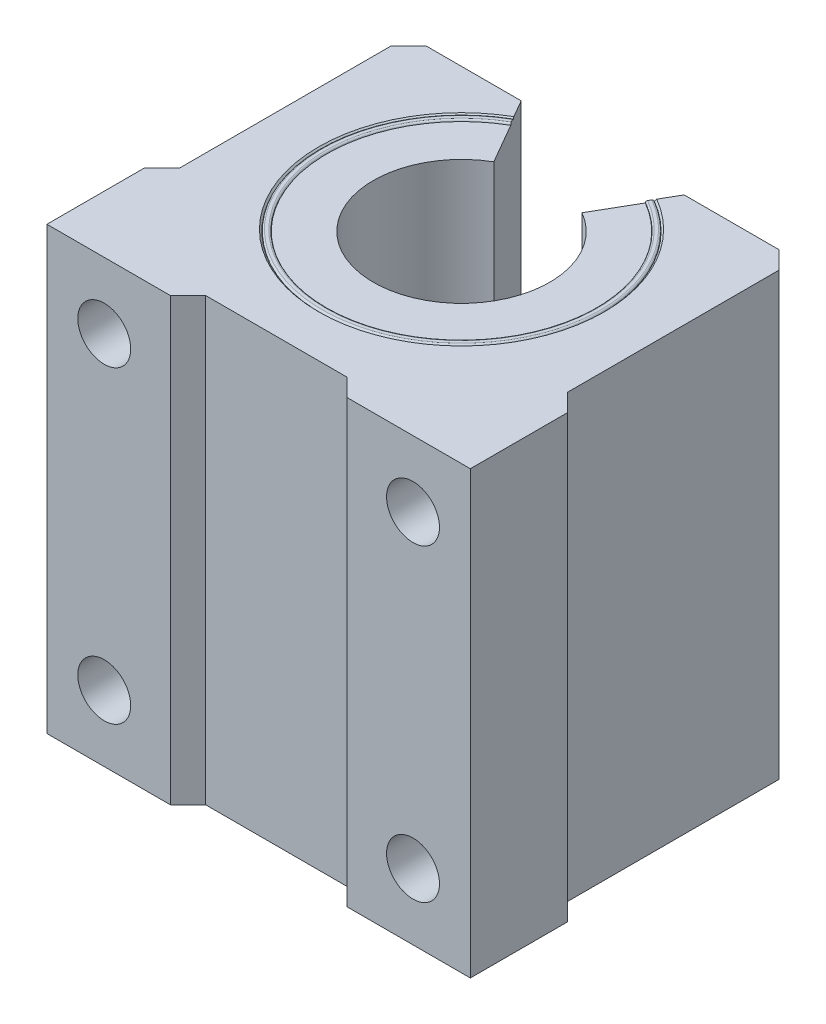
ISO-10303-21;
HEADER;
FILE_DESCRIPTION(('STEP AP214'),'2;1');
FILE_NAME('part.step','',(''),(''),'','','');
FILE_SCHEMA(('AUTOMOTIVE_DESIGN { 1 0 10303 214 1 1 1 1 }'));
ENDSEC;
DATA;
#1=APPLICATION_CONTEXT('core data for automotive mechanical design processes');
#2=APPLICATION_PROTOCOL_DEFINITION('international standard','automotive_design',2000,#1);
#3=PRODUCT_CONTEXT('',#1,'mechanical');
#4=PRODUCT('Part','Part','',(#3));
#5=PRODUCT_RELATED_PRODUCT_CATEGORY('part','',(#4));
#6=PRODUCT_DEFINITION_FORMATION('','',#4);
#7=PRODUCT_DEFINITION_CONTEXT('part definition',#1,'design');
#8=PRODUCT_DEFINITION('design','',#6,#7);
#9=PRODUCT_DEFINITION_SHAPE('','',#8);
#10=(LENGTH_UNIT() NAMED_UNIT(*) SI_UNIT(.MILLI.,.METRE.));
#11=(NAMED_UNIT(*) PLANE_ANGLE_UNIT() SI_UNIT($,.RADIAN.));
#12=(NAMED_UNIT(*) SI_UNIT($,.STERADIAN.) SOLID_ANGLE_UNIT());
#13=UNCERTAINTY_MEASURE_WITH_UNIT(LENGTH_MEASURE(1.E-05),#10,'distance_accuracy_value','');
#14=(GEOMETRIC_REPRESENTATION_CONTEXT(3) GLOBAL_UNCERTAINTY_ASSIGNED_CONTEXT((#13)) GLOBAL_UNIT_ASSIGNED_CONTEXT((#10,
#11,#12)) REPRESENTATION_CONTEXT('',''));
#15=CARTESIAN_POINT('',(0.,0.,0.));
#16=DIRECTION('',(0.,0.,1.));
#17=DIRECTION('',(1.,0.,0.));
#18=AXIS2_PLACEMENT_3D('',#15,#16,#17);
#19=CARTESIAN_POINT('',(0.,25.,0.));
#20=DIRECTION('',(0.,1.,0.));
#21=DIRECTION('',(0.,0.,1.));
#22=AXIS2_PLACEMENT_3D('',#19,#20,#21);
#23=PLANE('',#22);
#24=CARTESIAN_POINT('',(0.,25.,0.));
#25=DIRECTION('',(0.,1.,0.));
#26=DIRECTION('',(0.,0.,1.));
#27=AXIS2_PLACEMENT_3D('',#24,#25,#26);
#28=CIRCLE('',#27,15.45);
#29=CARTESIAN_POINT('',(-7.72500000000002,25.,-13.3800924884696));
#30=VERTEX_POINT('',#29);
#31=CARTESIAN_POINT('',(7.72499999999998,25.,-13.3800924884696));
#32=VERTEX_POINT('',#31);
#33=EDGE_CURVE('E221',#30,#32,#28,.T.);
#34=ORIENTED_EDGE('',*,*,#33,.F.);
#35=DIRECTION('',(-0.499999999999995,0.,-0.866025403784441));
#36=VECTOR('',#35,1.);
#37=CARTESIAN_POINT('',(-9.23760430703402,25.,-16.));
#38=LINE('',#37,#36);
#39=CARTESIAN_POINT('',(-7.89938053086695,25.,-13.6821284277819));
#40=VERTEX_POINT('',#39);
#41=EDGE_CURVE('E254',#30,#40,#38,.T.);
#42=ORIENTED_EDGE('',*,*,#41,.T.);
#43=CARTESIAN_POINT('',(0.,25.,0.));
#44=DIRECTION('',(0.,-1.,0.));
#45=DIRECTION('',(0.,0.,-1.));
#46=AXIS2_PLACEMENT_3D('',#43,#44,#45);
#47=CIRCLE('',#46,15.7987610617339);
#48=CARTESIAN_POINT('',(7.89938053086692,25.,-13.6821284277819));
#49=VERTEX_POINT('',#48);
#50=EDGE_CURVE('E244',#40,#49,#47,.F.);
#51=ORIENTED_EDGE('',*,*,#50,.T.);
#52=DIRECTION('',(-0.500000000000007,0.,0.866025403784435));
#53=VECTOR('',#52,1.);
#54=CARTESIAN_POINT('',(9.23760430703402,25.,-16.));
#55=LINE('',#54,#53);
#56=EDGE_CURVE('E237',#49,#32,#55,.T.);
#57=ORIENTED_EDGE('',*,*,#56,.T.);
#58=EDGE_LOOP('',(#34,#42,#51,#57));
#59=FACE_BOUND('',#58,.T.);
#60=ADVANCED_FACE('F36',(#59),#23,.T.);
#61=CARTESIAN_POINT('',(0.,-25.,0.));
#62=DIRECTION('',(0.,1.,0.));
#63=DIRECTION('',(0.,0.,1.));
#64=AXIS2_PLACEMENT_3D('',#61,#62,#63);
#65=PLANE('',#64);
#66=CARTESIAN_POINT('',(0.,-25.,0.));
#67=DIRECTION('',(0.,1.,0.));
#68=DIRECTION('',(0.,0.,1.));
#69=AXIS2_PLACEMENT_3D('',#66,#67,#68);
#70=CIRCLE('',#69,15.45);
#71=CARTESIAN_POINT('',(-7.72500000000002,-25.,-13.3800924884696));
#72=VERTEX_POINT('',#71);
#73=CARTESIAN_POINT('',(7.72499999999998,-25.,-13.3800924884696));
#74=VERTEX_POINT('',#73);
#75=EDGE_CURVE('E399',#72,#74,#70,.T.);
#76=ORIENTED_EDGE('',*,*,#75,.T.);
#77=DIRECTION('',(-0.500000000000007,0.,0.866025403784435));
#78=VECTOR('',#77,1.);
#79=CARTESIAN_POINT('',(9.23760430703402,-25.,-16.));
#80=LINE('',#79,#78);
#81=CARTESIAN_POINT('',(7.89938053086692,-25.,-13.6821284277819));
#82=VERTEX_POINT('',#81);
#83=EDGE_CURVE('E284',#82,#74,#80,.T.);
#84=ORIENTED_EDGE('',*,*,#83,.F.);
#85=CARTESIAN_POINT('',(0.,-25.,0.));
#86=DIRECTION('',(0.,1.,0.));
#87=DIRECTION('',(0.,0.,1.));
#88=AXIS2_PLACEMENT_3D('',#85,#86,#87);
#89=CIRCLE('',#88,15.7987610617339);
#90=CARTESIAN_POINT('',(-7.89938053086695,-25.,-13.6821284277819));
#91=VERTEX_POINT('',#90);
#92=EDGE_CURVE('E371',#82,#91,#89,.F.);
#93=ORIENTED_EDGE('',*,*,#92,.T.);
#94=DIRECTION('',(-0.499999999999995,0.,-0.866025403784441));
#95=VECTOR('',#94,1.);
#96=CARTESIAN_POINT('',(-9.23760430703402,-25.,-16.));
#97=LINE('',#96,#95);
#98=EDGE_CURVE('E289',#72,#91,#97,.T.);
#99=ORIENTED_EDGE('',*,*,#98,.F.);
#100=EDGE_LOOP('',(#76,#84,#93,#99));
#101=FACE_BOUND('',#100,.T.);
#102=ADVANCED_FACE('F540',(#101),#65,.F.);
#103=CARTESIAN_POINT('',(-8.,25.,21.));
#104=DIRECTION('',(0.,0.,-1.));
#105=DIRECTION('',(-1.,0.,0.));
#106=AXIS2_PLACEMENT_3D('',#103,#104,#105);
#107=PLANE('',#106);
#108=DIRECTION('',(1.,0.,0.));
#109=VECTOR('',#108,1.);
#110=CARTESIAN_POINT('',(-8.,-25.,21.));
#111=LINE('',#110,#109);
#112=CARTESIAN_POINT('',(-8.,-25.,21.));
#113=VERTEX_POINT('',#112);
#114=CARTESIAN_POINT('',(8.,-25.,21.));
#115=VERTEX_POINT('',#114);
#116=EDGE_CURVE('E269',#113,#115,#111,.T.);
#117=ORIENTED_EDGE('',*,*,#116,.T.);
#118=DIRECTION('',(0.,-1.,0.));
#119=VECTOR('',#118,1.);
#120=CARTESIAN_POINT('',(8.,25.,21.));
#121=LINE('',#120,#119);
#122=CARTESIAN_POINT('',(8.,25.,21.));
#123=VERTEX_POINT('',#122);
#124=EDGE_CURVE('E331',#123,#115,#121,.T.);
#125=ORIENTED_EDGE('',*,*,#124,.F.);
#126=DIRECTION('',(1.,0.,0.));
#127=VECTOR('',#126,1.);
#128=CARTESIAN_POINT('',(-8.,25.,21.));
#129=LINE('',#128,#127);
#130=CARTESIAN_POINT('',(-8.,25.,21.));
#131=VERTEX_POINT('',#130);
#132=EDGE_CURVE('E303',#131,#123,#129,.T.);
#133=ORIENTED_EDGE('',*,*,#132,.F.);
#134=DIRECTION('',(0.,-1.,0.));
#135=VECTOR('',#134,1.);
#136=CARTESIAN_POINT('',(-8.,25.,21.));
#137=LINE('',#136,#135);
#138=EDGE_CURVE('E334',#131,#113,#137,.T.);
#139=ORIENTED_EDGE('',*,*,#138,.T.);
#140=EDGE_LOOP('',(#117,#125,#133,#139));
#141=FACE_BOUND('',#140,.T.);
#142=ADVANCED_FACE('F511',(#141),#107,.F.);
#143=CARTESIAN_POINT('',(8.,25.,23.));
#144=DIRECTION('',(0.,0.,-1.));
#145=DIRECTION('',(-1.,0.,0.));
#146=AXIS2_PLACEMENT_3D('',#143,#144,#145);
#147=PLANE('',#146);
#148=CARTESIAN_POINT('',(17.5,-17.5,23.));
#149=DIRECTION('',(0.,0.,1.));
#150=DIRECTION('',(1.,0.,0.));
#151=AXIS2_PLACEMENT_3D('',#148,#149,#150);
#152=CIRCLE('',#151,3.);
#153=CARTESIAN_POINT('',(20.5,-17.5,23.));
#154=VERTEX_POINT('',#153);
#155=EDGE_CURVE('E424',#154,#154,#152,.T.);
#156=ORIENTED_EDGE('',*,*,#155,.F.);
#157=EDGE_LOOP('',(#156));
#158=FACE_BOUND('',#157,.T.);
#159=CARTESIAN_POINT('',(17.5,17.5,23.));
#160=DIRECTION('',(0.,0.,1.));
#161=DIRECTION('',(1.,0.,0.));
#162=AXIS2_PLACEMENT_3D('',#159,#160,#161);
#163=CIRCLE('',#162,3.);
#164=CARTESIAN_POINT('',(20.5,17.5,23.));
#165=VERTEX_POINT('',#164);
#166=EDGE_CURVE('E430',#165,#165,#163,.T.);
#167=ORIENTED_EDGE('',*,*,#166,.F.);
#168=EDGE_LOOP('',(#167));
#169=FACE_BOUND('',#168,.T.);
#170=DIRECTION('',(1.,0.,0.));
#171=VECTOR('',#170,1.);
#172=CARTESIAN_POINT('',(8.,25.,23.));
#173=LINE('',#172,#171);
#174=CARTESIAN_POINT('',(10.,25.,23.));
#175=VERTEX_POINT('',#174);
#176=CARTESIAN_POINT('',(24.,25.,23.));
#177=VERTEX_POINT('',#176);
#178=EDGE_CURVE('E444',#175,#177,#173,.T.);
#179=ORIENTED_EDGE('',*,*,#178,.F.);
#180=DIRECTION('',(0.,-1.,0.));
#181=VECTOR('',#180,1.);
#182=CARTESIAN_POINT('',(10.,25.,23.));
#183=LINE('',#182,#181);
#184=CARTESIAN_POINT('',(10.,-25.,23.));
#185=VERTEX_POINT('',#184);
#186=EDGE_CURVE('E347',#175,#185,#183,.T.);
#187=ORIENTED_EDGE('',*,*,#186,.T.);
#188=DIRECTION('',(1.,0.,0.));
#189=VECTOR('',#188,1.);
#190=CARTESIAN_POINT('',(8.,-25.,23.));
#191=LINE('',#190,#189);
#192=CARTESIAN_POINT('',(24.,-25.,23.));
#193=VERTEX_POINT('',#192);
#194=EDGE_CURVE('E272',#185,#193,#191,.T.);
#195=ORIENTED_EDGE('',*,*,#194,.T.);
#196=DIRECTION('',(0.,-1.,0.));
#197=VECTOR('',#196,1.);
#198=CARTESIAN_POINT('',(24.,25.,23.));
#199=LINE('',#198,#197);
#200=EDGE_CURVE('E328',#177,#193,#199,.T.);
#201=ORIENTED_EDGE('',*,*,#200,.F.);
#202=EDGE_LOOP('',(#179,#187,#195,#201));
#203=FACE_BOUND('',#202,.T.);
#204=ADVANCED_FACE('F519',(#158,#169,#203),#147,.F.);
#205=CARTESIAN_POINT('',(24.,25.,23.));
#206=DIRECTION('',(-1.,0.,0.));
#207=DIRECTION('',(0.,0.,1.));
#208=AXIS2_PLACEMENT_3D('',#205,#206,#207);
#209=PLANE('',#208);
#210=DIRECTION('',(0.,0.,-1.));
#211=VECTOR('',#210,1.);
#212=CARTESIAN_POINT('',(24.,-25.,23.));
#213=LINE('',#212,#211);
#214=CARTESIAN_POINT('',(24.,-25.,12.));
#215=VERTEX_POINT('',#214);
#216=EDGE_CURVE('E275',#193,#215,#213,.T.);
#217=ORIENTED_EDGE('',*,*,#216,.T.);
#218=DIRECTION('',(0.,-1.,0.));
#219=VECTOR('',#218,1.);
#220=CARTESIAN_POINT('',(24.,25.,12.));
#221=LINE('',#220,#219);
#222=CARTESIAN_POINT('',(24.,25.,12.));
#223=VERTEX_POINT('',#222);
#224=EDGE_CURVE('E325',#223,#215,#221,.T.);
#225=ORIENTED_EDGE('',*,*,#224,.F.);
#226=DIRECTION('',(0.,0.,-1.));
#227=VECTOR('',#226,1.);
#228=CARTESIAN_POINT('',(24.,25.,23.));
#229=LINE('',#228,#227);
#230=EDGE_CURVE('E446',#177,#223,#229,.T.);
#231=ORIENTED_EDGE('',*,*,#230,.F.);
#232=ORIENTED_EDGE('',*,*,#200,.T.);
#233=EDGE_LOOP('',(#217,#225,#231,#232));
#234=FACE_BOUND('',#233,.T.);
#235=ADVANCED_FACE('F526',(#234),#209,.F.);
#236=CARTESIAN_POINT('',(24.,25.,12.));
#237=DIRECTION('',(-0.707106781186544,0.,0.707106781186551));
#238=DIRECTION('',(0.707106781186551,0.,0.707106781186544));
#239=AXIS2_PLACEMENT_3D('',#236,#237,#238);
#240=PLANE('',#239);
#241=DIRECTION('',(-0.707106781186551,0.,-0.707106781186544));
#242=VECTOR('',#241,1.);
#243=CARTESIAN_POINT('',(24.,-25.,12.));
#244=LINE('',#243,#242);
#245=CARTESIAN_POINT('',(22.,-25.,10.));
#246=VERTEX_POINT('',#245);
#247=EDGE_CURVE('E277',#215,#246,#244,.T.);
#248=ORIENTED_EDGE('',*,*,#247,.T.);
#249=DIRECTION('',(0.,-1.,0.));
#250=VECTOR('',#249,1.);
#251=CARTESIAN_POINT('',(22.,25.,10.));
#252=LINE('',#251,#250);
#253=CARTESIAN_POINT('',(22.,25.,10.));
#254=VERTEX_POINT('',#253);
#255=EDGE_CURVE('E322',#254,#246,#252,.T.);
#256=ORIENTED_EDGE('',*,*,#255,.F.);
#257=DIRECTION('',(-0.707106781186551,0.,-0.707106781186544));
#258=VECTOR('',#257,1.);
#259=CARTESIAN_POINT('',(24.,25.,12.));
#260=LINE('',#259,#258);
#261=EDGE_CURVE('E448',#223,#254,#260,.T.);
#262=ORIENTED_EDGE('',*,*,#261,.F.);
#263=ORIENTED_EDGE('',*,*,#224,.T.);
#264=EDGE_LOOP('',(#248,#256,#262,#263));
#265=FACE_BOUND('',#264,.T.);
#266=ADVANCED_FACE('F529',(#265),#240,.F.);
#267=CARTESIAN_POINT('',(22.,25.,10.));
#268=DIRECTION('',(-1.,0.,0.));
#269=DIRECTION('',(0.,0.,1.));
#270=AXIS2_PLACEMENT_3D('',#267,#268,#269);
#271=PLANE('',#270);
#272=DIRECTION('',(0.,0.,-1.));
#273=VECTOR('',#272,1.);
#274=CARTESIAN_POINT('',(22.,-25.,10.));
#275=LINE('',#274,#273);
#276=CARTESIAN_POINT('',(22.,-25.,-14.));
#277=VERTEX_POINT('',#276);
#278=EDGE_CURVE('E279',#246,#277,#275,.T.);
#279=ORIENTED_EDGE('',*,*,#278,.T.);
#280=DIRECTION('',(0.,1.,0.));
#281=VECTOR('',#280,1.);
#282=CARTESIAN_POINT('',(22.,25.,-14.));
#283=LINE('',#282,#281);
#284=CARTESIAN_POINT('',(22.,25.,-14.));
#285=VERTEX_POINT('',#284);
#286=EDGE_CURVE('E366',#277,#285,#283,.T.);
#287=ORIENTED_EDGE('',*,*,#286,.T.);
#288=DIRECTION('',(0.,0.,-1.));
#289=VECTOR('',#288,1.);
#290=CARTESIAN_POINT('',(22.,25.,10.));
#291=LINE('',#290,#289);
#292=EDGE_CURVE('E250',#254,#285,#291,.T.);
#293=ORIENTED_EDGE('',*,*,#292,.F.);
#294=ORIENTED_EDGE('',*,*,#255,.T.);
#295=EDGE_LOOP('',(#279,#287,#293,#294));
#296=FACE_BOUND('',#295,.T.);
#297=ADVANCED_FACE('F530',(#296),#271,.F.);
#298=CARTESIAN_POINT('',(22.,25.,-16.));
#299=DIRECTION('',(0.,0.,1.));
#300=DIRECTION('',(1.,0.,0.));
#301=AXIS2_PLACEMENT_3D('',#298,#299,#300);
#302=PLANE('',#301);
#303=DIRECTION('',(-1.,0.,0.));
#304=VECTOR('',#303,1.);
#305=CARTESIAN_POINT('',(22.,25.,-16.));
#306=LINE('',#305,#304);
#307=CARTESIAN_POINT('',(20.,25.,-16.));
#308=VERTEX_POINT('',#307);
#309=CARTESIAN_POINT('',(9.23760430703402,25.,-16.));
#310=VERTEX_POINT('',#309);
#311=EDGE_CURVE('E246',#308,#310,#306,.T.);
#312=ORIENTED_EDGE('',*,*,#311,.F.);
#313=DIRECTION('',(0.,-1.,0.));
#314=VECTOR('',#313,1.);
#315=CARTESIAN_POINT('',(20.,25.,-16.));
#316=LINE('',#315,#314);
#317=CARTESIAN_POINT('',(20.,-25.,-16.));
#318=VERTEX_POINT('',#317);
#319=EDGE_CURVE('E363',#308,#318,#316,.T.);
#320=ORIENTED_EDGE('',*,*,#319,.T.);
#321=DIRECTION('',(-1.,0.,0.));
#322=VECTOR('',#321,1.);
#323=CARTESIAN_POINT('',(22.,-25.,-16.));
#324=LINE('',#323,#322);
#325=CARTESIAN_POINT('',(9.23760430703402,-25.,-16.));
#326=VERTEX_POINT('',#325);
#327=EDGE_CURVE('E282',#318,#326,#324,.T.);
#328=ORIENTED_EDGE('',*,*,#327,.T.);
#329=DIRECTION('',(0.,-1.,0.));
#330=VECTOR('',#329,1.);
#331=CARTESIAN_POINT('',(9.23760430703402,25.,-16.));
#332=LINE('',#331,#330);
#333=EDGE_CURVE('E319',#310,#326,#332,.T.);
#334=ORIENTED_EDGE('',*,*,#333,.F.);
#335=EDGE_LOOP('',(#312,#320,#328,#334));
#336=FACE_BOUND('',#335,.T.);
#337=ADVANCED_FACE('F463',(#336),#302,.F.);
#338=CARTESIAN_POINT('',(9.23760430703402,25.,-16.));
#339=DIRECTION('',(0.866025403784435,0.,0.500000000000007));
#340=DIRECTION('',(0.500000000000007,0.,-0.866025403784435));
#341=AXIS2_PLACEMENT_3D('',#338,#339,#340);
#342=PLANE('',#341);
#343=DIRECTION('',(0.500000000000007,0.,-0.866025403784435));
#344=VECTOR('',#343,1.);
#345=CARTESIAN_POINT('',(9.23760430703402,24.8,-16.));
#346=LINE('',#345,#344);
#347=CARTESIAN_POINT('',(4.99999999999995,24.8,-8.66025403784442));
#348=VERTEX_POINT('',#347);
#349=CARTESIAN_POINT('',(7.62499999999998,24.8,-13.2068874077127));
#350=VERTEX_POINT('',#349);
#351=EDGE_CURVE('E239',#348,#350,#346,.T.);
#352=ORIENTED_EDGE('',*,*,#351,.T.);
#353=CARTESIAN_POINT('',(7.72500000000011,24.8,-13.3800924884695));
#354=DIRECTION('',(0.866025403784435,0.,0.500000000000007));
#355=DIRECTION('',(0.500000000000007,0.,-0.866025403784435));
#356=AXIS2_PLACEMENT_3D('',#353,#354,#355);
#357=CIRCLE('',#356,0.200000000000002);
#358=EDGE_CURVE('E225',#350,#32,#357,.F.);
#359=ORIENTED_EDGE('',*,*,#358,.T.);
#360=ORIENTED_EDGE('',*,*,#56,.F.);
#361=CARTESIAN_POINT('',(7.89938053086704,24.7987572243138,-13.6821284277819));
#362=DIRECTION('',(0.866025403784435,0.,0.500000000000007));
#363=DIRECTION('',(0.500000000000007,0.,-0.866025403784435));
#364=AXIS2_PLACEMENT_3D('',#361,#362,#363);
#365=CIRCLE('',#364,0.2012427756862);
#366=CARTESIAN_POINT('',(7.99999999999999,24.8,-13.856406460551));
#367=VERTEX_POINT('',#366);
#368=EDGE_CURVE('E874',#49,#367,#365,.F.);
#369=ORIENTED_EDGE('',*,*,#368,.T.);
#370=DIRECTION('',(0.353553390593276,0.707106781186554,-0.612372435695786));
#371=VECTOR('',#370,1.);
#372=CARTESIAN_POINT('',(-1.24692111695184E-13,8.79999999999973,0.));
#373=LINE('',#372,#371);
#374=CARTESIAN_POINT('',(8.09999999999999,25.,-14.0296115413079));
#375=VERTEX_POINT('',#374);
#376=EDGE_CURVE('E472',#367,#375,#373,.T.);
#377=ORIENTED_EDGE('',*,*,#376,.T.);
#378=EDGE_CURVE('E245',#310,#375,#55,.T.);
#379=ORIENTED_EDGE('',*,*,#378,.F.);
#380=ORIENTED_EDGE('',*,*,#333,.T.);
#381=CARTESIAN_POINT('',(8.09999999999999,-25.,-14.0296115413079));
#382=VERTEX_POINT('',#381);
#383=EDGE_CURVE('E285',#326,#382,#80,.T.);
#384=ORIENTED_EDGE('',*,*,#383,.T.);
#385=DIRECTION('',(-0.353553390593276,0.707106781186554,0.612372435695786));
#386=VECTOR('',#385,1.);
#387=CARTESIAN_POINT('',(-1.24692111695184E-13,-8.79999999999973,0.));
#388=LINE('',#387,#386);
#389=CARTESIAN_POINT('',(7.99999999999999,-24.8,-13.856406460551));
#390=VERTEX_POINT('',#389);
#391=EDGE_CURVE('E411',#382,#390,#388,.T.);
#392=ORIENTED_EDGE('',*,*,#391,.T.);
#393=CARTESIAN_POINT('',(7.89938053086704,-24.7987572243138,-13.6821284277819));
#394=DIRECTION('',(0.866025403784435,0.,0.500000000000007));
#395=DIRECTION('',(0.500000000000007,0.,-0.866025403784435));
#396=AXIS2_PLACEMENT_3D('',#393,#394,#395);
#397=CIRCLE('',#396,0.2012427756862);
#398=EDGE_CURVE('E417',#390,#82,#397,.F.);
#399=ORIENTED_EDGE('',*,*,#398,.T.);
#400=ORIENTED_EDGE('',*,*,#83,.T.);
#401=CARTESIAN_POINT('',(7.72500000000011,-24.8,-13.3800924884695));
#402=DIRECTION('',(0.866025403784435,0.,0.500000000000007));
#403=DIRECTION('',(0.500000000000007,0.,-0.866025403784435));
#404=AXIS2_PLACEMENT_3D('',#401,#402,#403);
#405=CIRCLE('',#404,0.200000000000002);
#406=CARTESIAN_POINT('',(7.62499999999998,-24.8,-13.2068874077127));
#407=VERTEX_POINT('',#406);
#408=EDGE_CURVE('E396',#74,#407,#405,.F.);
#409=ORIENTED_EDGE('',*,*,#408,.T.);
#410=DIRECTION('',(-0.500000000000007,0.,0.866025403784435));
#411=VECTOR('',#410,1.);
#412=CARTESIAN_POINT('',(9.23760430703402,-24.8,-16.));
#413=LINE('',#412,#411);
#414=CARTESIAN_POINT('',(4.99999999999995,-24.8,-8.66025403784442));
#415=VERTEX_POINT('',#414);
#416=EDGE_CURVE('E393',#407,#415,#413,.T.);
#417=ORIENTED_EDGE('',*,*,#416,.T.);
#418=DIRECTION('',(0.,-1.,0.));
#419=VECTOR('',#418,1.);
#420=CARTESIAN_POINT('',(4.99999999999995,25.,-8.66025403784442));
#421=LINE('',#420,#419);
#422=EDGE_CURVE('E317',#348,#415,#421,.T.);
#423=ORIENTED_EDGE('',*,*,#422,.F.);
#424=EDGE_LOOP('',(#352,#359,#360,#369,#377,#379,#380,#384,#392,#399,#400,#409,#417,#423));
#425=FACE_BOUND('',#424,.T.);
#426=ADVANCED_FACE('F235',(#425),#342,.F.);
#427=CARTESIAN_POINT('',(0.,25.,0.));
#428=DIRECTION('',(0.,-1.,0.));
#429=DIRECTION('',(0.,0.,-1.));
#430=AXIS2_PLACEMENT_3D('',#427,#428,#429);
#431=CYLINDRICAL_SURFACE('',#430,10.);
#432=DIRECTION('',(0.,-1.,0.));
#433=VECTOR('',#432,1.);
#434=CARTESIAN_POINT('',(-5.00000000000005,25.,-8.66025403784436));
#435=LINE('',#434,#433);
#436=CARTESIAN_POINT('',(-5.00000000000005,24.8,-8.66025403784436));
#437=VERTEX_POINT('',#436);
#438=CARTESIAN_POINT('',(-5.00000000000005,-24.8,-8.66025403784436));
#439=VERTEX_POINT('',#438);
#440=EDGE_CURVE('E315',#437,#439,#435,.T.);
#441=ORIENTED_EDGE('',*,*,#440,.F.);
#442=CARTESIAN_POINT('',(0.,24.8,0.));
#443=DIRECTION('',(0.,-1.,0.));
#444=DIRECTION('',(0.,0.,-1.));
#445=AXIS2_PLACEMENT_3D('',#442,#443,#444);
#446=CIRCLE('',#445,10.);
#447=EDGE_CURVE('E51',#437,#348,#446,.F.);
#448=ORIENTED_EDGE('',*,*,#447,.T.);
#449=ORIENTED_EDGE('',*,*,#422,.T.);
#450=CARTESIAN_POINT('',(0.,-24.8,0.));
#451=DIRECTION('',(0.,1.,0.));
#452=DIRECTION('',(0.,0.,1.));
#453=AXIS2_PLACEMENT_3D('',#450,#451,#452);
#454=CIRCLE('',#453,10.);
#455=EDGE_CURVE('E390',#415,#439,#454,.F.);
#456=ORIENTED_EDGE('',*,*,#455,.T.);
#457=EDGE_LOOP('',(#441,#448,#449,#456));
#458=FACE_BOUND('',#457,.T.);
#459=ADVANCED_FACE('F388',(#458),#431,.F.);
#460=CARTESIAN_POINT('',(-9.23760430703402,25.,-16.));
#461=DIRECTION('',(-0.866025403784442,0.,0.499999999999995));
#462=DIRECTION('',(0.499999999999995,0.,0.866025403784442));
#463=AXIS2_PLACEMENT_3D('',#460,#461,#462);
#464=PLANE('',#463);
#465=ORIENTED_EDGE('',*,*,#41,.F.);
#466=CARTESIAN_POINT('',(-7.72499999999992,24.8,-13.3800924884696));
#467=DIRECTION('',(-0.866025403784442,0.,0.499999999999995));
#468=DIRECTION('',(0.499999999999995,0.,0.866025403784442));
#469=AXIS2_PLACEMENT_3D('',#466,#467,#468);
#470=CIRCLE('',#469,0.200000000000002);
#471=CARTESIAN_POINT('',(-7.62500000000002,24.8,-13.2068874077127));
#472=VERTEX_POINT('',#471);
#473=EDGE_CURVE('E11',#30,#472,#470,.F.);
#474=ORIENTED_EDGE('',*,*,#473,.T.);
#475=DIRECTION('',(0.499999999999995,0.,0.866025403784442));
#476=VECTOR('',#475,1.);
#477=CARTESIAN_POINT('',(-9.23760430703402,24.8,-16.));
#478=LINE('',#477,#476);
#479=EDGE_CURVE('E44',#472,#437,#478,.T.);
#480=ORIENTED_EDGE('',*,*,#479,.T.);
#481=ORIENTED_EDGE('',*,*,#440,.T.);
#482=DIRECTION('',(-0.499999999999995,0.,-0.866025403784442));
#483=VECTOR('',#482,1.);
#484=CARTESIAN_POINT('',(-9.23760430703402,-24.8,-16.));
#485=LINE('',#484,#483);
#486=CARTESIAN_POINT('',(-7.62500000000002,-24.8,-13.2068874077127));
#487=VERTEX_POINT('',#486);
#488=EDGE_CURVE('E374',#439,#487,#485,.T.);
#489=ORIENTED_EDGE('',*,*,#488,.T.);
#490=CARTESIAN_POINT('',(-7.72499999999992,-24.8,-13.3800924884696));
#491=DIRECTION('',(-0.866025403784442,0.,0.499999999999995));
#492=DIRECTION('',(0.499999999999995,0.,0.866025403784442));
#493=AXIS2_PLACEMENT_3D('',#490,#491,#492);
#494=CIRCLE('',#493,0.200000000000002);
#495=EDGE_CURVE('E377',#487,#72,#494,.F.);
#496=ORIENTED_EDGE('',*,*,#495,.T.);
#497=ORIENTED_EDGE('',*,*,#98,.T.);
#498=CARTESIAN_POINT('',(-7.89938053086685,-24.7987572243138,-13.682128427782));
#499=DIRECTION('',(-0.866025403784442,0.,0.499999999999995));
#500=DIRECTION('',(0.499999999999995,0.,0.866025403784442));
#501=AXIS2_PLACEMENT_3D('',#498,#499,#500);
#502=CIRCLE('',#501,0.2012427756862);
#503=CARTESIAN_POINT('',(-8.00000000000002,-24.8,-13.856406460551));
#504=VERTEX_POINT('',#503);
#505=EDGE_CURVE('E414',#91,#504,#502,.F.);
#506=ORIENTED_EDGE('',*,*,#505,.T.);
#507=DIRECTION('',(-0.353553390593267,-0.707106781186554,-0.612372435695791));
#508=VECTOR('',#507,1.);
#509=CARTESIAN_POINT('',(-1.03659707312864E-13,-8.79999999999973,0.));
#510=LINE('',#509,#508);
#511=CARTESIAN_POINT('',(-8.10000000000002,-25.,-14.0296115413079));
#512=VERTEX_POINT('',#511);
#513=EDGE_CURVE('E408',#504,#512,#510,.T.);
#514=ORIENTED_EDGE('',*,*,#513,.T.);
#515=CARTESIAN_POINT('',(-9.23760430703402,-25.,-16.));
#516=VERTEX_POINT('',#515);
#517=EDGE_CURVE('E288',#512,#516,#97,.T.);
#518=ORIENTED_EDGE('',*,*,#517,.T.);
#519=DIRECTION('',(0.,-1.,0.));
#520=VECTOR('',#519,1.);
#521=CARTESIAN_POINT('',(-9.23760430703402,25.,-16.));
#522=LINE('',#521,#520);
#523=CARTESIAN_POINT('',(-9.23760430703402,25.,-16.));
#524=VERTEX_POINT('',#523);
#525=EDGE_CURVE('E312',#524,#516,#522,.T.);
#526=ORIENTED_EDGE('',*,*,#525,.F.);
#527=CARTESIAN_POINT('',(-8.10000000000002,25.,-14.0296115413079));
#528=VERTEX_POINT('',#527);
#529=EDGE_CURVE('E249',#528,#524,#38,.T.);
#530=ORIENTED_EDGE('',*,*,#529,.F.);
#531=DIRECTION('',(0.353553390593267,-0.707106781186554,0.612372435695791));
#532=VECTOR('',#531,1.);
#533=CARTESIAN_POINT('',(-1.03659707312864E-13,8.79999999999973,0.));
#534=LINE('',#533,#532);
#535=CARTESIAN_POINT('',(-8.00000000000002,24.8,-13.856406460551));
#536=VERTEX_POINT('',#535);
#537=EDGE_CURVE('E59',#528,#536,#534,.T.);
#538=ORIENTED_EDGE('',*,*,#537,.T.);
#539=CARTESIAN_POINT('',(-7.89938053086685,24.7987572243138,-13.682128427782));
#540=DIRECTION('',(-0.866025403784442,0.,0.499999999999995));
#541=DIRECTION('',(0.499999999999995,0.,0.866025403784442));
#542=AXIS2_PLACEMENT_3D('',#539,#540,#541);
#543=CIRCLE('',#542,0.2012427756862);
#544=EDGE_CURVE('E872',#536,#40,#543,.F.);
#545=ORIENTED_EDGE('',*,*,#544,.T.);
#546=EDGE_LOOP('',(#465,#474,#480,#481,#489,#496,#497,#506,#514,#518,#526,#530,#538,#545));
#547=FACE_BOUND('',#546,.T.);
#548=ADVANCED_FACE('F384',(#547),#464,.F.);
#549=CARTESIAN_POINT('',(-9.23760430703402,25.,-16.));
#550=DIRECTION('',(0.,0.,1.));
#551=DIRECTION('',(1.,0.,0.));
#552=AXIS2_PLACEMENT_3D('',#549,#550,#551);
#553=PLANE('',#552);
#554=DIRECTION('',(-1.,0.,0.));
#555=VECTOR('',#554,1.);
#556=CARTESIAN_POINT('',(-9.23760430703402,-25.,-16.));
#557=LINE('',#556,#555);
#558=CARTESIAN_POINT('',(-20.,-25.,-16.));
#559=VERTEX_POINT('',#558);
#560=EDGE_CURVE('E291',#516,#559,#557,.T.);
#561=ORIENTED_EDGE('',*,*,#560,.T.);
#562=DIRECTION('',(0.,1.,0.));
#563=VECTOR('',#562,1.);
#564=CARTESIAN_POINT('',(-20.,25.,-16.));
#565=LINE('',#564,#563);
#566=CARTESIAN_POINT('',(-20.,25.,-16.));
#567=VERTEX_POINT('',#566);
#568=EDGE_CURVE('E357',#559,#567,#565,.T.);
#569=ORIENTED_EDGE('',*,*,#568,.T.);
#570=DIRECTION('',(-1.,0.,0.));
#571=VECTOR('',#570,1.);
#572=CARTESIAN_POINT('',(-9.23760430703402,25.,-16.));
#573=LINE('',#572,#571);
#574=EDGE_CURVE('E256',#524,#567,#573,.T.);
#575=ORIENTED_EDGE('',*,*,#574,.F.);
#576=ORIENTED_EDGE('',*,*,#525,.T.);
#577=EDGE_LOOP('',(#561,#569,#575,#576));
#578=FACE_BOUND('',#577,.T.);
#579=ADVANCED_FACE('F479',(#578),#553,.F.);
#580=CARTESIAN_POINT('',(-22.,25.,-16.));
#581=DIRECTION('',(1.,0.,0.));
#582=DIRECTION('',(0.,0.,-1.));
#583=AXIS2_PLACEMENT_3D('',#580,#581,#582);
#584=PLANE('',#583);
#585=DIRECTION('',(0.,0.,1.));
#586=VECTOR('',#585,1.);
#587=CARTESIAN_POINT('',(-22.,25.,-16.));
#588=LINE('',#587,#586);
#589=CARTESIAN_POINT('',(-22.,25.,-14.));
#590=VERTEX_POINT('',#589);
#591=CARTESIAN_POINT('',(-22.,25.,9.99999999999999));
#592=VERTEX_POINT('',#591);
#593=EDGE_CURVE('E259',#590,#592,#588,.T.);
#594=ORIENTED_EDGE('',*,*,#593,.F.);
#595=DIRECTION('',(0.,-1.,0.));
#596=VECTOR('',#595,1.);
#597=CARTESIAN_POINT('',(-22.,25.,-14.));
#598=LINE('',#597,#596);
#599=CARTESIAN_POINT('',(-22.,-25.,-14.));
#600=VERTEX_POINT('',#599);
#601=EDGE_CURVE('E350',#590,#600,#598,.T.);
#602=ORIENTED_EDGE('',*,*,#601,.T.);
#603=DIRECTION('',(0.,0.,1.));
#604=VECTOR('',#603,1.);
#605=CARTESIAN_POINT('',(-22.,-25.,-16.));
#606=LINE('',#605,#604);
#607=CARTESIAN_POINT('',(-22.,-25.,9.99999999999999));
#608=VERTEX_POINT('',#607);
#609=EDGE_CURVE('E294',#600,#608,#606,.T.);
#610=ORIENTED_EDGE('',*,*,#609,.T.);
#611=DIRECTION('',(0.,-1.,0.));
#612=VECTOR('',#611,1.);
#613=CARTESIAN_POINT('',(-22.,25.,9.99999999999999));
#614=LINE('',#613,#612);
#615=EDGE_CURVE('E309',#592,#608,#614,.T.);
#616=ORIENTED_EDGE('',*,*,#615,.F.);
#617=EDGE_LOOP('',(#594,#602,#610,#616));
#618=FACE_BOUND('',#617,.T.);
#619=ADVANCED_FACE('F488',(#618),#584,.F.);
#620=CARTESIAN_POINT('',(-22.,25.,9.99999999999999));
#621=DIRECTION('',(0.707106781186549,0.,0.707106781186546));
#622=DIRECTION('',(0.707106781186546,0.,-0.707106781186549));
#623=AXIS2_PLACEMENT_3D('',#620,#621,#622);
#624=PLANE('',#623);
#625=DIRECTION('',(-0.707106781186546,0.,0.707106781186549));
#626=VECTOR('',#625,1.);
#627=CARTESIAN_POINT('',(-22.,-25.,9.99999999999999));
#628=LINE('',#627,#626);
#629=CARTESIAN_POINT('',(-24.,-25.,12.));
#630=VERTEX_POINT('',#629);
#631=EDGE_CURVE('E296',#608,#630,#628,.T.);
#632=ORIENTED_EDGE('',*,*,#631,.T.);
#633=DIRECTION('',(0.,-1.,0.));
#634=VECTOR('',#633,1.);
#635=CARTESIAN_POINT('',(-24.,25.,12.));
#636=LINE('',#635,#634);
#637=CARTESIAN_POINT('',(-24.,25.,12.));
#638=VERTEX_POINT('',#637);
#639=EDGE_CURVE('E306',#638,#630,#636,.T.);
#640=ORIENTED_EDGE('',*,*,#639,.F.);
#641=DIRECTION('',(-0.707106781186546,0.,0.707106781186549));
#642=VECTOR('',#641,1.);
#643=CARTESIAN_POINT('',(-22.,25.,9.99999999999999));
#644=LINE('',#643,#642);
#645=EDGE_CURVE('E261',#592,#638,#644,.T.);
#646=ORIENTED_EDGE('',*,*,#645,.F.);
#647=ORIENTED_EDGE('',*,*,#615,.T.);
#648=EDGE_LOOP('',(#632,#640,#646,#647));
#649=FACE_BOUND('',#648,.T.);
#650=ADVANCED_FACE('F495',(#649),#624,.F.);
#651=CARTESIAN_POINT('',(-24.,25.,12.));
#652=DIRECTION('',(1.,0.,0.));
#653=DIRECTION('',(0.,0.,-1.));
#654=AXIS2_PLACEMENT_3D('',#651,#652,#653);
#655=PLANE('',#654);
#656=DIRECTION('',(0.,0.,1.));
#657=VECTOR('',#656,1.);
#658=CARTESIAN_POINT('',(-24.,-25.,12.));
#659=LINE('',#658,#657);
#660=CARTESIAN_POINT('',(-24.,-25.,23.));
#661=VERTEX_POINT('',#660);
#662=EDGE_CURVE('E298',#630,#661,#659,.T.);
#663=ORIENTED_EDGE('',*,*,#662,.T.);
#664=DIRECTION('',(0.,-1.,0.));
#665=VECTOR('',#664,1.);
#666=CARTESIAN_POINT('',(-24.,25.,23.));
#667=LINE('',#666,#665);
#668=CARTESIAN_POINT('',(-24.,25.,23.));
#669=VERTEX_POINT('',#668);
#670=EDGE_CURVE('E268',#669,#661,#667,.T.);
#671=ORIENTED_EDGE('',*,*,#670,.F.);
#672=DIRECTION('',(0.,0.,1.));
#673=VECTOR('',#672,1.);
#674=CARTESIAN_POINT('',(-24.,25.,12.));
#675=LINE('',#674,#673);
#676=EDGE_CURVE('E263',#638,#669,#675,.T.);
#677=ORIENTED_EDGE('',*,*,#676,.F.);
#678=ORIENTED_EDGE('',*,*,#639,.T.);
#679=EDGE_LOOP('',(#663,#671,#677,#678));
#680=FACE_BOUND('',#679,.T.);
#681=ADVANCED_FACE('F499',(#680),#655,.F.);
#682=CARTESIAN_POINT('',(-24.,25.,23.));
#683=DIRECTION('',(0.,0.,-1.));
#684=DIRECTION('',(-1.,0.,0.));
#685=AXIS2_PLACEMENT_3D('',#682,#683,#684);
#686=PLANE('',#685);
#687=CARTESIAN_POINT('',(-17.5,-17.5,23.));
#688=DIRECTION('',(0.,0.,1.));
#689=DIRECTION('',(1.,0.,0.));
#690=AXIS2_PLACEMENT_3D('',#687,#688,#689);
#691=CIRCLE('',#690,3.);
#692=CARTESIAN_POINT('',(-14.5,-17.5,23.));
#693=VERTEX_POINT('',#692);
#694=EDGE_CURVE('E420',#693,#693,#691,.T.);
#695=ORIENTED_EDGE('',*,*,#694,.F.);
#696=EDGE_LOOP('',(#695));
#697=FACE_BOUND('',#696,.T.);
#698=CARTESIAN_POINT('',(-17.5,17.5,23.));
#699=DIRECTION('',(0.,0.,1.));
#700=DIRECTION('',(1.,0.,0.));
#701=AXIS2_PLACEMENT_3D('',#698,#699,#700);
#702=CIRCLE('',#701,3.);
#703=CARTESIAN_POINT('',(-14.5,17.5,23.));
#704=VERTEX_POINT('',#703);
#705=EDGE_CURVE('E436',#704,#704,#702,.T.);
#706=ORIENTED_EDGE('',*,*,#705,.F.);
#707=EDGE_LOOP('',(#706));
#708=FACE_BOUND('',#707,.T.);
#709=DIRECTION('',(1.,0.,0.));
#710=VECTOR('',#709,1.);
#711=CARTESIAN_POINT('',(-24.,-25.,23.));
#712=LINE('',#711,#710);
#713=CARTESIAN_POINT('',(-10.,-25.,23.));
#714=VERTEX_POINT('',#713);
#715=EDGE_CURVE('E300',#661,#714,#712,.T.);
#716=ORIENTED_EDGE('',*,*,#715,.T.);
#717=DIRECTION('',(0.,1.,0.));
#718=VECTOR('',#717,1.);
#719=CARTESIAN_POINT('',(-10.,25.,23.));
#720=LINE('',#719,#718);
#721=CARTESIAN_POINT('',(-10.,25.,23.));
#722=VERTEX_POINT('',#721);
#723=EDGE_CURVE('E341',#714,#722,#720,.T.);
#724=ORIENTED_EDGE('',*,*,#723,.T.);
#725=DIRECTION('',(1.,0.,0.));
#726=VECTOR('',#725,1.);
#727=CARTESIAN_POINT('',(-24.,25.,23.));
#728=LINE('',#727,#726);
#729=EDGE_CURVE('E265',#669,#722,#728,.T.);
#730=ORIENTED_EDGE('',*,*,#729,.F.);
#731=ORIENTED_EDGE('',*,*,#670,.T.);
#732=EDGE_LOOP('',(#716,#724,#730,#731));
#733=FACE_BOUND('',#732,.T.);
#734=ADVANCED_FACE('F549',(#697,#708,#733),#686,.F.);
#735=CARTESIAN_POINT('',(0.,25.,0.));
#736=DIRECTION('',(0.,1.,0.));
#737=DIRECTION('',(0.,0.,1.));
#738=AXIS2_PLACEMENT_3D('',#735,#736,#737);
#739=CIRCLE('',#738,16.2);
#740=EDGE_CURVE('E380',#528,#375,#739,.T.);
#741=ORIENTED_EDGE('',*,*,#740,.F.);
#742=ORIENTED_EDGE('',*,*,#529,.T.);
#743=ORIENTED_EDGE('',*,*,#574,.T.);
#744=DIRECTION('',(0.707106781186549,0.,-0.707106781186546));
#745=VECTOR('',#744,1.);
#746=CARTESIAN_POINT('',(-18.,25.,-18.));
#747=LINE('',#746,#745);
#748=EDGE_CURVE('E361',#567,#590,#747,.F.);
#749=ORIENTED_EDGE('',*,*,#748,.T.);
#750=ORIENTED_EDGE('',*,*,#593,.T.);
#751=ORIENTED_EDGE('',*,*,#645,.T.);
#752=ORIENTED_EDGE('',*,*,#676,.T.);
#753=ORIENTED_EDGE('',*,*,#729,.T.);
#754=DIRECTION('',(-0.707106781186549,0.,0.707106781186546));
#755=VECTOR('',#754,1.);
#756=CARTESIAN_POINT('',(6.50000000000001,25.,6.50000000000004));
#757=LINE('',#756,#755);
#758=EDGE_CURVE('E345',#722,#131,#757,.F.);
#759=ORIENTED_EDGE('',*,*,#758,.T.);
#760=ORIENTED_EDGE('',*,*,#132,.T.);
#761=DIRECTION('',(-0.707106781186546,0.,-0.707106781186549));
#762=VECTOR('',#761,1.);
#763=CARTESIAN_POINT('',(-6.49999999999998,25.,6.49999999999995));
#764=LINE('',#763,#762);
#765=EDGE_CURVE('E343',#123,#175,#764,.F.);
#766=ORIENTED_EDGE('',*,*,#765,.T.);
#767=ORIENTED_EDGE('',*,*,#178,.T.);
#768=ORIENTED_EDGE('',*,*,#230,.T.);
#769=ORIENTED_EDGE('',*,*,#261,.T.);
#770=ORIENTED_EDGE('',*,*,#292,.T.);
#771=DIRECTION('',(0.707106781186546,0.,0.707106781186549));
#772=VECTOR('',#771,1.);
#773=CARTESIAN_POINT('',(18.,25.,-18.));
#774=LINE('',#773,#772);
#775=EDGE_CURVE('E359',#285,#308,#774,.F.);
#776=ORIENTED_EDGE('',*,*,#775,.T.);
#777=ORIENTED_EDGE('',*,*,#311,.T.);
#778=ORIENTED_EDGE('',*,*,#378,.T.);
#779=EDGE_LOOP('',(#741,#742,#743,#749,#750,#751,#752,#753,#759,#760,#766,#767,#768,#769,#770,
#776,#777,#778));
#780=FACE_BOUND('',#779,.T.);
#781=ADVANCED_FACE('F453',(#780),#23,.T.);
#782=ORIENTED_EDGE('',*,*,#517,.F.);
#783=CARTESIAN_POINT('',(0.,-25.,0.));
#784=DIRECTION('',(0.,1.,0.));
#785=DIRECTION('',(0.,0.,1.));
#786=AXIS2_PLACEMENT_3D('',#783,#784,#785);
#787=CIRCLE('',#786,16.2);
#788=EDGE_CURVE('E368',#512,#382,#787,.T.);
#789=ORIENTED_EDGE('',*,*,#788,.T.);
#790=ORIENTED_EDGE('',*,*,#383,.F.);
#791=ORIENTED_EDGE('',*,*,#327,.F.);
#792=DIRECTION('',(-0.707106781186546,0.,-0.707106781186549));
#793=VECTOR('',#792,1.);
#794=CARTESIAN_POINT('',(20.,-25.,-16.));
#795=LINE('',#794,#793);
#796=EDGE_CURVE('E353',#318,#277,#795,.F.);
#797=ORIENTED_EDGE('',*,*,#796,.T.);
#798=ORIENTED_EDGE('',*,*,#278,.F.);
#799=ORIENTED_EDGE('',*,*,#247,.F.);
#800=ORIENTED_EDGE('',*,*,#216,.F.);
#801=ORIENTED_EDGE('',*,*,#194,.F.);
#802=DIRECTION('',(0.707106781186546,0.,0.707106781186549));
#803=VECTOR('',#802,1.);
#804=CARTESIAN_POINT('',(10.,-25.,23.));
#805=LINE('',#804,#803);
#806=EDGE_CURVE('E337',#185,#115,#805,.F.);
#807=ORIENTED_EDGE('',*,*,#806,.T.);
#808=ORIENTED_EDGE('',*,*,#116,.F.);
#809=DIRECTION('',(0.707106781186549,0.,-0.707106781186546));
#810=VECTOR('',#809,1.);
#811=CARTESIAN_POINT('',(-8.,-25.,21.));
#812=LINE('',#811,#810);
#813=EDGE_CURVE('E339',#113,#714,#812,.F.);
#814=ORIENTED_EDGE('',*,*,#813,.T.);
#815=ORIENTED_EDGE('',*,*,#715,.F.);
#816=ORIENTED_EDGE('',*,*,#662,.F.);
#817=ORIENTED_EDGE('',*,*,#631,.F.);
#818=ORIENTED_EDGE('',*,*,#609,.F.);
#819=DIRECTION('',(-0.707106781186549,0.,0.707106781186546));
#820=VECTOR('',#819,1.);
#821=CARTESIAN_POINT('',(-22.,-25.,-14.));
#822=LINE('',#821,#820);
#823=EDGE_CURVE('E355',#600,#559,#822,.F.);
#824=ORIENTED_EDGE('',*,*,#823,.T.);
#825=ORIENTED_EDGE('',*,*,#560,.F.);
#826=EDGE_LOOP('',(#782,#789,#790,#791,#797,#798,#799,#800,#801,#807,#808,#814,#815,#816,#817,
#818,#824,#825));
#827=FACE_BOUND('',#826,.T.);
#828=ADVANCED_FACE('F468',(#827),#65,.F.);
#829=CARTESIAN_POINT('',(-8.,25.,21.));
#830=DIRECTION('',(-0.707106781186546,0.,-0.707106781186549));
#831=DIRECTION('',(-0.707106781186549,0.,0.707106781186546));
#832=AXIS2_PLACEMENT_3D('',#829,#830,#831);
#833=PLANE('',#832);
#834=ORIENTED_EDGE('',*,*,#758,.F.);
#835=ORIENTED_EDGE('',*,*,#723,.F.);
#836=ORIENTED_EDGE('',*,*,#813,.F.);
#837=ORIENTED_EDGE('',*,*,#138,.F.);
#838=EDGE_LOOP('',(#834,#835,#836,#837));
#839=FACE_BOUND('',#838,.T.);
#840=ADVANCED_FACE('F508',(#839),#833,.F.);
#841=CARTESIAN_POINT('',(10.,25.,23.));
#842=DIRECTION('',(0.707106781186549,0.,-0.707106781186546));
#843=DIRECTION('',(-0.707106781186546,0.,-0.707106781186549));
#844=AXIS2_PLACEMENT_3D('',#841,#842,#843);
#845=PLANE('',#844);
#846=ORIENTED_EDGE('',*,*,#765,.F.);
#847=ORIENTED_EDGE('',*,*,#124,.T.);
#848=ORIENTED_EDGE('',*,*,#806,.F.);
#849=ORIENTED_EDGE('',*,*,#186,.F.);
#850=EDGE_LOOP('',(#846,#847,#848,#849));
#851=FACE_BOUND('',#850,.T.);
#852=ADVANCED_FACE('F522',(#851),#845,.F.);
#853=CARTESIAN_POINT('',(-17.5,17.5,11.));
#854=DIRECTION('',(0.,0.,1.));
#855=DIRECTION('',(1.,0.,0.));
#856=AXIS2_PLACEMENT_3D('',#853,#854,#855);
#857=CYLINDRICAL_SURFACE('',#856,3.);
#858=CARTESIAN_POINT('',(-17.5,17.5,11.));
#859=DIRECTION('',(0.,0.,1.));
#860=DIRECTION('',(1.,0.,0.));
#861=AXIS2_PLACEMENT_3D('',#858,#859,#860);
#862=CIRCLE('',#861,3.);
#863=CARTESIAN_POINT('',(-14.5,17.5,11.));
#864=VERTEX_POINT('',#863);
#865=EDGE_CURVE('E273',#864,#864,#862,.T.);
#866=ORIENTED_EDGE('',*,*,#865,.F.);
#867=EDGE_LOOP('',(#866));
#868=FACE_BOUND('',#867,.T.);
#869=ORIENTED_EDGE('',*,*,#705,.T.);
#870=EDGE_LOOP('',(#869));
#871=FACE_BOUND('',#870,.T.);
#872=ADVANCED_FACE('F633',(#868,#871),#857,.F.);
#873=CARTESIAN_POINT('',(-17.5,17.5,11.));
#874=DIRECTION('',(0.,0.,1.));
#875=DIRECTION('',(1.,0.,0.));
#876=AXIS2_PLACEMENT_3D('',#873,#874,#875);
#877=PLANE('',#876);
#878=ORIENTED_EDGE('',*,*,#865,.T.);
#879=EDGE_LOOP('',(#878));
#880=FACE_BOUND('',#879,.T.);
#881=ADVANCED_FACE('F655',(#880),#877,.T.);
#882=CARTESIAN_POINT('',(17.5,17.5,11.));
#883=DIRECTION('',(0.,0.,1.));
#884=DIRECTION('',(1.,0.,0.));
#885=AXIS2_PLACEMENT_3D('',#882,#883,#884);
#886=CYLINDRICAL_SURFACE('',#885,3.);
#887=CARTESIAN_POINT('',(17.5,17.5,11.));
#888=DIRECTION('',(0.,0.,1.));
#889=DIRECTION('',(1.,0.,0.));
#890=AXIS2_PLACEMENT_3D('',#887,#888,#889);
#891=CIRCLE('',#890,3.);
#892=CARTESIAN_POINT('',(20.5,17.5,11.));
#893=VERTEX_POINT('',#892);
#894=EDGE_CURVE('E433',#893,#893,#891,.T.);
#895=ORIENTED_EDGE('',*,*,#894,.F.);
#896=EDGE_LOOP('',(#895));
#897=FACE_BOUND('',#896,.T.);
#898=ORIENTED_EDGE('',*,*,#166,.T.);
#899=EDGE_LOOP('',(#898));
#900=FACE_BOUND('',#899,.T.);
#901=ADVANCED_FACE('F664',(#897,#900),#886,.F.);
#902=CARTESIAN_POINT('',(17.5,17.5,11.));
#903=DIRECTION('',(0.,0.,1.));
#904=DIRECTION('',(1.,0.,0.));
#905=AXIS2_PLACEMENT_3D('',#902,#903,#904);
#906=PLANE('',#905);
#907=ORIENTED_EDGE('',*,*,#894,.T.);
#908=EDGE_LOOP('',(#907));
#909=FACE_BOUND('',#908,.T.);
#910=ADVANCED_FACE('F674',(#909),#906,.T.);
#911=CARTESIAN_POINT('',(17.5,-17.5,11.));
#912=DIRECTION('',(0.,0.,1.));
#913=DIRECTION('',(1.,0.,0.));
#914=AXIS2_PLACEMENT_3D('',#911,#912,#913);
#915=CYLINDRICAL_SURFACE('',#914,3.);
#916=CARTESIAN_POINT('',(17.5,-17.5,11.));
#917=DIRECTION('',(0.,0.,1.));
#918=DIRECTION('',(1.,0.,0.));
#919=AXIS2_PLACEMENT_3D('',#916,#917,#918);
#920=CIRCLE('',#919,3.);
#921=CARTESIAN_POINT('',(20.5,-17.5,11.));
#922=VERTEX_POINT('',#921);
#923=EDGE_CURVE('E427',#922,#922,#920,.T.);
#924=ORIENTED_EDGE('',*,*,#923,.F.);
#925=EDGE_LOOP('',(#924));
#926=FACE_BOUND('',#925,.T.);
#927=ORIENTED_EDGE('',*,*,#155,.T.);
#928=EDGE_LOOP('',(#927));
#929=FACE_BOUND('',#928,.T.);
#930=ADVANCED_FACE('F684',(#926,#929),#915,.F.);
#931=CARTESIAN_POINT('',(17.5,-17.5,11.));
#932=DIRECTION('',(0.,0.,1.));
#933=DIRECTION('',(1.,0.,0.));
#934=AXIS2_PLACEMENT_3D('',#931,#932,#933);
#935=PLANE('',#934);
#936=ORIENTED_EDGE('',*,*,#923,.T.);
#937=EDGE_LOOP('',(#936));
#938=FACE_BOUND('',#937,.T.);
#939=ADVANCED_FACE('F694',(#938),#935,.T.);
#940=CARTESIAN_POINT('',(-17.5,-17.5,11.));
#941=DIRECTION('',(0.,0.,1.));
#942=DIRECTION('',(1.,0.,0.));
#943=AXIS2_PLACEMENT_3D('',#940,#941,#942);
#944=CYLINDRICAL_SURFACE('',#943,3.);
#945=CARTESIAN_POINT('',(-17.5,-17.5,11.));
#946=DIRECTION('',(0.,0.,1.));
#947=DIRECTION('',(1.,0.,0.));
#948=AXIS2_PLACEMENT_3D('',#945,#946,#947);
#949=CIRCLE('',#948,3.);
#950=CARTESIAN_POINT('',(-14.5,-17.5,11.));
#951=VERTEX_POINT('',#950);
#952=EDGE_CURVE('E421',#951,#951,#949,.T.);
#953=ORIENTED_EDGE('',*,*,#952,.F.);
#954=EDGE_LOOP('',(#953));
#955=FACE_BOUND('',#954,.T.);
#956=ORIENTED_EDGE('',*,*,#694,.T.);
#957=EDGE_LOOP('',(#956));
#958=FACE_BOUND('',#957,.T.);
#959=ADVANCED_FACE('F704',(#955,#958),#944,.F.);
#960=CARTESIAN_POINT('',(-17.5,-17.5,11.));
#961=DIRECTION('',(0.,0.,1.));
#962=DIRECTION('',(1.,0.,0.));
#963=AXIS2_PLACEMENT_3D('',#960,#961,#962);
#964=PLANE('',#963);
#965=ORIENTED_EDGE('',*,*,#952,.T.);
#966=EDGE_LOOP('',(#965));
#967=FACE_BOUND('',#966,.T.);
#968=ADVANCED_FACE('F714',(#967),#964,.T.);
#969=CARTESIAN_POINT('',(-22.,25.,-14.));
#970=DIRECTION('',(0.707106781186546,0.,0.707106781186549));
#971=DIRECTION('',(0.707106781186549,0.,-0.707106781186546));
#972=AXIS2_PLACEMENT_3D('',#969,#970,#971);
#973=PLANE('',#972);
#974=ORIENTED_EDGE('',*,*,#748,.F.);
#975=ORIENTED_EDGE('',*,*,#568,.F.);
#976=ORIENTED_EDGE('',*,*,#823,.F.);
#977=ORIENTED_EDGE('',*,*,#601,.F.);
#978=EDGE_LOOP('',(#974,#975,#976,#977));
#979=FACE_BOUND('',#978,.T.);
#980=ADVANCED_FACE('F485',(#979),#973,.F.);
#981=CARTESIAN_POINT('',(20.,25.,-16.));
#982=DIRECTION('',(-0.707106781186549,0.,0.707106781186546));
#983=DIRECTION('',(0.707106781186546,0.,0.707106781186549));
#984=AXIS2_PLACEMENT_3D('',#981,#982,#983);
#985=PLANE('',#984);
#986=ORIENTED_EDGE('',*,*,#775,.F.);
#987=ORIENTED_EDGE('',*,*,#286,.F.);
#988=ORIENTED_EDGE('',*,*,#796,.F.);
#989=ORIENTED_EDGE('',*,*,#319,.F.);
#990=EDGE_LOOP('',(#986,#987,#988,#989));
#991=FACE_BOUND('',#990,.T.);
#992=ADVANCED_FACE('F38',(#991),#985,.F.);
#993=CARTESIAN_POINT('',(0.,-24.7987572243138,0.));
#994=DIRECTION('',(0.,1.,0.));
#995=DIRECTION('',(0.,0.,1.));
#996=AXIS2_PLACEMENT_3D('',#993,#994,#995);
#997=TOROIDAL_SURFACE('',#996,15.7987610617339,0.2012427756862);
#998=CARTESIAN_POINT('',(0.,-24.8,0.));
#999=DIRECTION('',(0.,1.,0.));
#1000=DIRECTION('',(0.,0.,1.));
#1001=AXIS2_PLACEMENT_3D('',#998,#999,#1000);
#1002=CIRCLE('',#1001,16.);
#1003=EDGE_CURVE('E405',#504,#390,#1002,.T.);
#1004=ORIENTED_EDGE('',*,*,#1003,.F.);
#1005=ORIENTED_EDGE('',*,*,#505,.F.);
#1006=ORIENTED_EDGE('',*,*,#92,.F.);
#1007=ORIENTED_EDGE('',*,*,#398,.F.);
#1008=EDGE_LOOP('',(#1004,#1005,#1006,#1007));
#1009=FACE_BOUND('',#1008,.T.);
#1010=ADVANCED_FACE('F763',(#1009),#997,.T.);
#1011=CARTESIAN_POINT('',(0.,-24.8,0.));
#1012=DIRECTION('',(0.,-1.,0.));
#1013=DIRECTION('',(0.,0.,-1.));
#1014=AXIS2_PLACEMENT_3D('',#1011,#1012,#1013);
#1015=CONICAL_SURFACE('',#1014,16.,0.78539816339744);
#1016=ORIENTED_EDGE('',*,*,#788,.F.);
#1017=ORIENTED_EDGE('',*,*,#513,.F.);
#1018=ORIENTED_EDGE('',*,*,#1003,.T.);
#1019=ORIENTED_EDGE('',*,*,#391,.F.);
#1020=EDGE_LOOP('',(#1016,#1017,#1018,#1019));
#1021=FACE_BOUND('',#1020,.T.);
#1022=ADVANCED_FACE('F767',(#1021),#1015,.F.);
#1023=CARTESIAN_POINT('',(0.,-24.8,0.));
#1024=DIRECTION('',(0.,1.,0.));
#1025=DIRECTION('',(0.,0.,1.));
#1026=AXIS2_PLACEMENT_3D('',#1023,#1024,#1025);
#1027=TOROIDAL_SURFACE('',#1026,15.45,0.200000000000002);
#1028=ORIENTED_EDGE('',*,*,#75,.F.);
#1029=ORIENTED_EDGE('',*,*,#495,.F.);
#1030=CARTESIAN_POINT('',(0.,-24.8,0.));
#1031=DIRECTION('',(0.,1.,0.));
#1032=DIRECTION('',(0.,0.,1.));
#1033=AXIS2_PLACEMENT_3D('',#1030,#1031,#1032);
#1034=CIRCLE('',#1033,15.25);
#1035=EDGE_CURVE('E394',#487,#407,#1034,.T.);
#1036=ORIENTED_EDGE('',*,*,#1035,.T.);
#1037=ORIENTED_EDGE('',*,*,#408,.F.);
#1038=EDGE_LOOP('',(#1028,#1029,#1036,#1037));
#1039=FACE_BOUND('',#1038,.T.);
#1040=ADVANCED_FACE('F773',(#1039),#1027,.T.);
#1041=CARTESIAN_POINT('',(0.,-24.8,15.25));
#1042=DIRECTION('',(0.,1.,0.));
#1043=DIRECTION('',(0.,0.,1.));
#1044=AXIS2_PLACEMENT_3D('',#1041,#1042,#1043);
#1045=PLANE('',#1044);
#1046=ORIENTED_EDGE('',*,*,#1035,.F.);
#1047=ORIENTED_EDGE('',*,*,#488,.F.);
#1048=ORIENTED_EDGE('',*,*,#455,.F.);
#1049=ORIENTED_EDGE('',*,*,#416,.F.);
#1050=EDGE_LOOP('',(#1046,#1047,#1048,#1049));
#1051=FACE_BOUND('',#1050,.T.);
#1052=ADVANCED_FACE('F780',(#1051),#1045,.F.);
#1053=CARTESIAN_POINT('',(0.,24.7987572243138,0.));
#1054=DIRECTION('',(0.,-1.,0.));
#1055=DIRECTION('',(0.,0.,1.));
#1056=AXIS2_PLACEMENT_3D('',#1053,#1054,#1055);
#1057=TOROIDAL_SURFACE('',#1056,15.7987610617339,0.2012427756862);
#1058=ORIENTED_EDGE('',*,*,#50,.F.);
#1059=ORIENTED_EDGE('',*,*,#544,.F.);
#1060=CARTESIAN_POINT('',(0.,24.8,0.));
#1061=DIRECTION('',(0.,1.,0.));
#1062=DIRECTION('',(0.,0.,1.));
#1063=AXIS2_PLACEMENT_3D('',#1060,#1061,#1062);
#1064=CIRCLE('',#1063,16.);
#1065=EDGE_CURVE('E240',#536,#367,#1064,.T.);
#1066=ORIENTED_EDGE('',*,*,#1065,.T.);
#1067=ORIENTED_EDGE('',*,*,#368,.F.);
#1068=EDGE_LOOP('',(#1058,#1059,#1066,#1067));
#1069=FACE_BOUND('',#1068,.T.);
#1070=ADVANCED_FACE('F784',(#1069),#1057,.T.);
#1071=CARTESIAN_POINT('',(0.,24.8,0.));
#1072=DIRECTION('',(0.,1.,0.));
#1073=DIRECTION('',(0.,0.,-1.));
#1074=AXIS2_PLACEMENT_3D('',#1071,#1072,#1073);
#1075=CONICAL_SURFACE('',#1074,16.,0.78539816339744);
#1076=ORIENTED_EDGE('',*,*,#1065,.F.);
#1077=ORIENTED_EDGE('',*,*,#537,.F.);
#1078=ORIENTED_EDGE('',*,*,#740,.T.);
#1079=ORIENTED_EDGE('',*,*,#376,.F.);
#1080=EDGE_LOOP('',(#1076,#1077,#1078,#1079));
#1081=FACE_BOUND('',#1080,.T.);
#1082=ADVANCED_FACE('F787',(#1081),#1075,.F.);
#1083=CARTESIAN_POINT('',(0.,24.8,0.));
#1084=DIRECTION('',(0.,-1.,0.));
#1085=DIRECTION('',(0.,0.,1.));
#1086=AXIS2_PLACEMENT_3D('',#1083,#1084,#1085);
#1087=TOROIDAL_SURFACE('',#1086,15.45,0.200000000000002);
#1088=CARTESIAN_POINT('',(0.,24.8,0.));
#1089=DIRECTION('',(0.,1.,0.));
#1090=DIRECTION('',(0.,0.,1.));
#1091=AXIS2_PLACEMENT_3D('',#1088,#1089,#1090);
#1092=CIRCLE('',#1091,15.25);
#1093=EDGE_CURVE('E230',#472,#350,#1092,.T.);
#1094=ORIENTED_EDGE('',*,*,#1093,.F.);
#1095=ORIENTED_EDGE('',*,*,#473,.F.);
#1096=ORIENTED_EDGE('',*,*,#33,.T.);
#1097=ORIENTED_EDGE('',*,*,#358,.F.);
#1098=EDGE_LOOP('',(#1094,#1095,#1096,#1097));
#1099=FACE_BOUND('',#1098,.T.);
#1100=ADVANCED_FACE('F224',(#1099),#1087,.T.);
#1101=CARTESIAN_POINT('',(0.,24.8,15.25));
#1102=DIRECTION('',(0.,-1.,0.));
#1103=DIRECTION('',(0.,0.,1.));
#1104=AXIS2_PLACEMENT_3D('',#1101,#1102,#1103);
#1105=PLANE('',#1104);
#1106=ORIENTED_EDGE('',*,*,#447,.F.);
#1107=ORIENTED_EDGE('',*,*,#479,.F.);
#1108=ORIENTED_EDGE('',*,*,#1093,.T.);
#1109=ORIENTED_EDGE('',*,*,#351,.F.);
#1110=EDGE_LOOP('',(#1106,#1107,#1108,#1109));
#1111=FACE_BOUND('',#1110,.T.);
#1112=ADVANCED_FACE('F793',(#1111),#1105,.F.);
#1113=CLOSED_SHELL('',(#60,#102,#142,#204,#235,#266,#297,#337,#426,#459,#548,#579,#619,#650,
#681,#734,#781,#828,#840,#852,#872,#881,#901,#910,#930,#939,#959,#968,#980,#992,#1010,#1022,
#1040,#1052,#1070,#1082,#1100,#1112));
#1114=MANIFOLD_SOLID_BREP('B2',#1113);
#1115=ADVANCED_BREP_SHAPE_REPRESENTATION('',(#18,#1114),#14);
#1116=SHAPE_DEFINITION_REPRESENTATION(#9,#1115);
ENDSEC;
END-ISO-10303-21;
